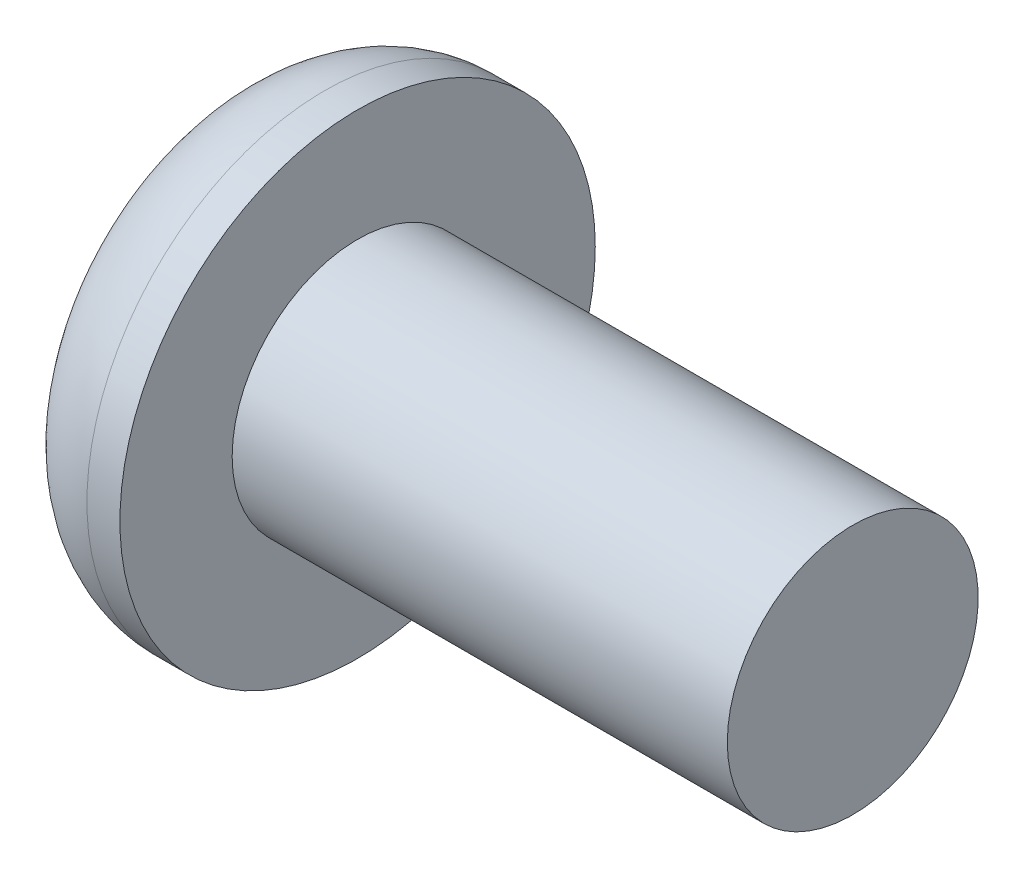
ISO-10303-21;
HEADER;
FILE_DESCRIPTION(('STEP AP214'),'2;1');
FILE_NAME('part.step','',(''),(''),'','','');
FILE_SCHEMA(('AUTOMOTIVE_DESIGN { 1 0 10303 214 1 1 1 1 }'));
ENDSEC;
DATA;
#1=APPLICATION_CONTEXT('core data for automotive mechanical design processes');
#2=APPLICATION_PROTOCOL_DEFINITION('international standard','automotive_design',2000,#1);
#3=PRODUCT_CONTEXT('',#1,'mechanical');
#4=PRODUCT('Part','Part','',(#3));
#5=PRODUCT_RELATED_PRODUCT_CATEGORY('part','',(#4));
#6=PRODUCT_DEFINITION_FORMATION('','',#4);
#7=PRODUCT_DEFINITION_CONTEXT('part definition',#1,'design');
#8=PRODUCT_DEFINITION('design','',#6,#7);
#9=PRODUCT_DEFINITION_SHAPE('','',#8);
#10=(LENGTH_UNIT() NAMED_UNIT(*) SI_UNIT(.MILLI.,.METRE.));
#11=(NAMED_UNIT(*) PLANE_ANGLE_UNIT() SI_UNIT($,.RADIAN.));
#12=(NAMED_UNIT(*) SI_UNIT($,.STERADIAN.) SOLID_ANGLE_UNIT());
#13=UNCERTAINTY_MEASURE_WITH_UNIT(LENGTH_MEASURE(1.E-05),#10,'distance_accuracy_value','');
#14=(GEOMETRIC_REPRESENTATION_CONTEXT(3) GLOBAL_UNCERTAINTY_ASSIGNED_CONTEXT((#13)) GLOBAL_UNIT_ASSIGNED_CONTEXT((#10,
#11,#12)) REPRESENTATION_CONTEXT('',''));
#15=CARTESIAN_POINT('',(0.,0.,0.));
#16=DIRECTION('',(0.,0.,1.));
#17=DIRECTION('',(1.,0.,0.));
#18=AXIS2_PLACEMENT_3D('',#15,#16,#17);
#19=CARTESIAN_POINT('',(2.54,0.,0.));
#20=DIRECTION('',(-1.,0.,0.));
#21=DIRECTION('',(0.,0.,1.));
#22=AXIS2_PLACEMENT_3D('',#19,#20,#21);
#23=CYLINDRICAL_SURFACE('',#22,4.572);
#24=CARTESIAN_POINT('',(1.905,0.,0.));
#25=DIRECTION('',(1.,0.,0.));
#26=DIRECTION('',(0.,0.,-1.));
#27=AXIS2_PLACEMENT_3D('',#24,#25,#26);
#28=CIRCLE('',#27,4.572);
#29=CARTESIAN_POINT('',(1.905,0.,-4.572));
#30=VERTEX_POINT('',#29);
#31=EDGE_CURVE('E41',#30,#30,#28,.T.);
#32=ORIENTED_EDGE('',*,*,#31,.T.);
#33=EDGE_LOOP('',(#32));
#34=FACE_BOUND('',#33,.T.);
#35=CARTESIAN_POINT('',(2.54,0.,0.));
#36=DIRECTION('',(1.,0.,0.));
#37=DIRECTION('',(0.,0.,-1.));
#38=AXIS2_PLACEMENT_3D('',#35,#36,#37);
#39=CIRCLE('',#38,4.572);
#40=CARTESIAN_POINT('',(2.54,0.,-4.572));
#41=VERTEX_POINT('',#40);
#42=EDGE_CURVE('E143',#41,#41,#39,.T.);
#43=ORIENTED_EDGE('',*,*,#42,.F.);
#44=EDGE_LOOP('',(#43));
#45=FACE_BOUND('',#44,.T.);
#46=ADVANCED_FACE('F33',(#34,#45),#23,.T.);
#47=CARTESIAN_POINT('',(2.54,0.,0.));
#48=DIRECTION('',(1.,0.,0.));
#49=DIRECTION('',(0.,0.,-1.));
#50=AXIS2_PLACEMENT_3D('',#47,#48,#49);
#51=PLANE('',#50);
#52=CARTESIAN_POINT('',(2.54,0.,0.));
#53=DIRECTION('',(1.,0.,0.));
#54=DIRECTION('',(0.,0.,-1.));
#55=AXIS2_PLACEMENT_3D('',#52,#53,#54);
#56=CIRCLE('',#55,2.413);
#57=CARTESIAN_POINT('',(2.54,0.,2.413));
#58=VERTEX_POINT('',#57);
#59=EDGE_CURVE('E144',#58,#58,#56,.T.);
#60=ORIENTED_EDGE('',*,*,#59,.F.);
#61=EDGE_LOOP('',(#60));
#62=FACE_BOUND('',#61,.T.);
#63=ORIENTED_EDGE('',*,*,#42,.T.);
#64=EDGE_LOOP('',(#63));
#65=FACE_BOUND('',#64,.T.);
#66=ADVANCED_FACE('F168',(#62,#65),#51,.T.);
#67=CARTESIAN_POINT('',(0.,0.,0.));
#68=DIRECTION('',(1.,0.,0.));
#69=DIRECTION('',(0.,0.,-1.));
#70=AXIS2_PLACEMENT_3D('',#67,#68,#69);
#71=PLANE('',#70);
#72=DIRECTION('',(0.,0.999888133515311,0.0149572876975553));
#73=VECTOR('',#72,1.);
#74=CARTESIAN_POINT('',(0.,-0.940185716053139,1.5736134063559));
#75=LINE('',#74,#73);
#76=CARTESIAN_POINT('',(0.,-0.940185716053139,1.5736134063559));
#77=VERTEX_POINT('',#76);
#78=CARTESIAN_POINT('',(0.,0.892696327613401,1.60103141755523));
#79=VERTEX_POINT('',#78);
#80=EDGE_CURVE('E122',#77,#79,#75,.T.);
#81=ORIENTED_EDGE('',*,*,#80,.F.);
#82=DIRECTION('',(0.,0.48699067563986,0.873407168415644));
#83=VECTOR('',#82,1.);
#84=CARTESIAN_POINT('',(0.,-1.83288204366654,-0.0274180111993328));
#85=LINE('',#84,#83);
#86=CARTESIAN_POINT('',(0.,-1.83288204366654,-0.0274180111993328));
#87=VERTEX_POINT('',#86);
#88=EDGE_CURVE('E48',#87,#77,#85,.T.);
#89=ORIENTED_EDGE('',*,*,#88,.F.);
#90=DIRECTION('',(0.,-0.512897457875451,0.858449880718088));
#91=VECTOR('',#90,1.);
#92=CARTESIAN_POINT('',(0.,-0.892696327613401,-1.60103141755523));
#93=LINE('',#92,#91);
#94=CARTESIAN_POINT('',(0.,-0.892696327613401,-1.60103141755523));
#95=VERTEX_POINT('',#94);
#96=EDGE_CURVE('E131',#95,#87,#93,.T.);
#97=ORIENTED_EDGE('',*,*,#96,.F.);
#98=DIRECTION('',(0.,-0.999888133515311,-0.014957287697555));
#99=VECTOR('',#98,1.);
#100=CARTESIAN_POINT('',(0.,0.940185716053139,-1.5736134063559));
#101=LINE('',#100,#99);
#102=CARTESIAN_POINT('',(0.,0.940185716053139,-1.5736134063559));
#103=VERTEX_POINT('',#102);
#104=EDGE_CURVE('E129',#103,#95,#101,.T.);
#105=ORIENTED_EDGE('',*,*,#104,.F.);
#106=DIRECTION('',(0.,-0.48699067563986,-0.873407168415644));
#107=VECTOR('',#106,1.);
#108=CARTESIAN_POINT('',(0.,1.83288204366654,0.0274180111993334));
#109=LINE('',#108,#107);
#110=CARTESIAN_POINT('',(0.,1.83288204366654,0.0274180111993334));
#111=VERTEX_POINT('',#110);
#112=EDGE_CURVE('E96',#111,#103,#109,.T.);
#113=ORIENTED_EDGE('',*,*,#112,.F.);
#114=DIRECTION('',(0.,0.512897457875451,-0.858449880718088));
#115=VECTOR('',#114,1.);
#116=CARTESIAN_POINT('',(0.,0.892696327613401,1.60103141755523));
#117=LINE('',#116,#115);
#118=EDGE_CURVE('E125',#79,#111,#117,.T.);
#119=ORIENTED_EDGE('',*,*,#118,.F.);
#120=EDGE_LOOP('',(#81,#89,#97,#105,#113,#119));
#121=FACE_BOUND('',#120,.T.);
#122=CARTESIAN_POINT('',(0.,0.,0.));
#123=DIRECTION('',(1.,0.,0.));
#124=DIRECTION('',(0.,0.,-1.));
#125=AXIS2_PLACEMENT_3D('',#122,#123,#124);
#126=CIRCLE('',#125,2.667);
#127=CARTESIAN_POINT('',(0.,0.,-2.667));
#128=VERTEX_POINT('',#127);
#129=EDGE_CURVE('E11',#128,#128,#126,.F.);
#130=ORIENTED_EDGE('',*,*,#129,.T.);
#131=EDGE_LOOP('',(#130));
#132=FACE_BOUND('',#131,.T.);
#133=ADVANCED_FACE('F172',(#121,#132),#71,.F.);
#134=CARTESIAN_POINT('',(12.065,0.,0.));
#135=DIRECTION('',(-1.,0.,0.));
#136=DIRECTION('',(0.,0.,1.));
#137=AXIS2_PLACEMENT_3D('',#134,#135,#136);
#138=CYLINDRICAL_SURFACE('',#137,2.413);
#139=CARTESIAN_POINT('',(12.065,0.,0.));
#140=DIRECTION('',(1.,0.,0.));
#141=DIRECTION('',(0.,0.,-1.));
#142=AXIS2_PLACEMENT_3D('',#139,#140,#141);
#143=CIRCLE('',#142,2.413);
#144=CARTESIAN_POINT('',(12.065,0.,2.413));
#145=VERTEX_POINT('',#144);
#146=EDGE_CURVE('E135',#145,#145,#143,.T.);
#147=CARTESIAN_POINT('',(12.065,0.,2.413));
#148=CARTESIAN_POINT('',(11.96578125,0.,2.413));
#149=CARTESIAN_POINT('',(11.8665625,0.,2.413));
#150=CARTESIAN_POINT('',(11.668125,0.,2.413));
#151=CARTESIAN_POINT('',(11.56890625,0.,2.413));
#152=CARTESIAN_POINT('',(11.37046875,0.,2.413));
#153=CARTESIAN_POINT('',(11.27125,0.,2.413));
#154=CARTESIAN_POINT('',(11.0728125,0.,2.413));
#155=CARTESIAN_POINT('',(10.97359375,0.,2.413));
#156=CARTESIAN_POINT('',(10.77515625,0.,2.413));
#157=CARTESIAN_POINT('',(10.6759375,0.,2.413));
#158=CARTESIAN_POINT('',(10.4775,0.,2.413));
#159=CARTESIAN_POINT('',(10.37828125,0.,2.413));
#160=CARTESIAN_POINT('',(10.17984375,0.,2.413));
#161=CARTESIAN_POINT('',(10.080625,0.,2.413));
#162=CARTESIAN_POINT('',(9.8821875,0.,2.413));
#163=CARTESIAN_POINT('',(9.78296875,0.,2.413));
#164=CARTESIAN_POINT('',(9.58453125,0.,2.413));
#165=CARTESIAN_POINT('',(9.4853125,0.,2.413));
#166=CARTESIAN_POINT('',(9.286875,0.,2.413));
#167=CARTESIAN_POINT('',(9.18765625,0.,2.413));
#168=CARTESIAN_POINT('',(8.98921875,0.,2.413));
#169=CARTESIAN_POINT('',(8.89,0.,2.413));
#170=CARTESIAN_POINT('',(8.6915625,0.,2.413));
#171=CARTESIAN_POINT('',(8.59234375,0.,2.413));
#172=CARTESIAN_POINT('',(8.39390625,0.,2.413));
#173=CARTESIAN_POINT('',(8.2946875,0.,2.413));
#174=CARTESIAN_POINT('',(8.09625,0.,2.413));
#175=CARTESIAN_POINT('',(7.99703125,0.,2.413));
#176=CARTESIAN_POINT('',(7.79859375,0.,2.413));
#177=CARTESIAN_POINT('',(7.699375,0.,2.413));
#178=CARTESIAN_POINT('',(7.5009375,0.,2.413));
#179=CARTESIAN_POINT('',(7.40171875,0.,2.413));
#180=CARTESIAN_POINT('',(7.20328125,0.,2.413));
#181=CARTESIAN_POINT('',(7.1040625,0.,2.413));
#182=CARTESIAN_POINT('',(6.905625,0.,2.413));
#183=CARTESIAN_POINT('',(6.80640625,0.,2.413));
#184=CARTESIAN_POINT('',(6.60796875,0.,2.413));
#185=CARTESIAN_POINT('',(6.50875,0.,2.413));
#186=CARTESIAN_POINT('',(6.3103125,0.,2.413));
#187=CARTESIAN_POINT('',(6.21109375,0.,2.413));
#188=CARTESIAN_POINT('',(6.01265625,0.,2.413));
#189=CARTESIAN_POINT('',(5.9134375,0.,2.413));
#190=CARTESIAN_POINT('',(5.715,0.,2.413));
#191=CARTESIAN_POINT('',(5.61578125,0.,2.413));
#192=CARTESIAN_POINT('',(5.41734375,0.,2.413));
#193=CARTESIAN_POINT('',(5.318125,0.,2.413));
#194=CARTESIAN_POINT('',(5.1196875,0.,2.413));
#195=CARTESIAN_POINT('',(5.02046875,0.,2.413));
#196=CARTESIAN_POINT('',(4.82203125,0.,2.413));
#197=CARTESIAN_POINT('',(4.7228125,0.,2.413));
#198=CARTESIAN_POINT('',(4.524375,0.,2.413));
#199=CARTESIAN_POINT('',(4.42515625,0.,2.413));
#200=CARTESIAN_POINT('',(4.22671875,0.,2.413));
#201=CARTESIAN_POINT('',(4.1275,0.,2.413));
#202=CARTESIAN_POINT('',(3.9290625,0.,2.413));
#203=CARTESIAN_POINT('',(3.82984375,0.,2.413));
#204=CARTESIAN_POINT('',(3.63140625,0.,2.413));
#205=CARTESIAN_POINT('',(3.5321875,0.,2.413));
#206=CARTESIAN_POINT('',(3.33375,0.,2.413));
#207=CARTESIAN_POINT('',(3.23453125,0.,2.413));
#208=CARTESIAN_POINT('',(3.03609375,0.,2.413));
#209=CARTESIAN_POINT('',(2.936875,0.,2.413));
#210=CARTESIAN_POINT('',(2.7384375,0.,2.413));
#211=CARTESIAN_POINT('',(2.63921875,0.,2.413));
#212=CARTESIAN_POINT('',(2.54,0.,2.413));
#213=B_SPLINE_CURVE_WITH_KNOTS('',3,(#147,#148,#149,#150,#151,#152,#153,#154,#155,#156,#157,
#158,#159,#160,#161,#162,#163,#164,#165,#166,#167,#168,#169,#170,#171,#172,#173,#174,#175,#176,
#177,#178,#179,#180,#181,#182,#183,#184,#185,#186,#187,#188,#189,#190,#191,#192,#193,#194,#195,
#196,#197,#198,#199,#200,#201,#202,#203,#204,#205,#206,#207,#208,#209,#210,#211,#212),
.UNSPECIFIED.,.F.,.F.,(4,2,2,2,2,2,2,2,2,2,2,2,2,2,2,2,2,2,2,2,2,2,2,2,2,2,2,2,2,2,2,2,4),(0.,
0.29765625,0.5953125,0.892968750000001,1.190625,1.48828125,1.7859375,2.08359375,2.38125,
2.67890625,2.9765625,3.27421875,3.571875,3.86953125,4.1671875,4.46484375,4.7625,5.06015625,
5.3578125,5.65546875,5.953125,6.25078125,6.5484375,6.84609375,7.14375,7.44140625,7.7390625,
8.03671875,8.334375,8.63203125,8.9296875,9.22734375,9.525),.UNSPECIFIED.);
#214=EDGE_CURVE('BSEAM163',#145,#58,#213,.T.);
#215=ORIENTED_EDGE('',*,*,#146,.F.);
#216=ORIENTED_EDGE('',*,*,#59,.T.);
#217=ORIENTED_EDGE('',*,*,#214,.T.);
#218=ORIENTED_EDGE('',*,*,#214,.F.);
#219=EDGE_LOOP('',(#215,#217,#216,#218));
#220=FACE_BOUND('',#219,.T.);
#221=ADVANCED_FACE('F163',(#220),#138,.T.);
#222=CARTESIAN_POINT('',(12.065,0.,0.));
#223=DIRECTION('',(1.,0.,0.));
#224=DIRECTION('',(0.,0.,-1.));
#225=AXIS2_PLACEMENT_3D('',#222,#223,#224);
#226=PLANE('',#225);
#227=ORIENTED_EDGE('',*,*,#146,.T.);
#228=EDGE_LOOP('',(#227));
#229=FACE_BOUND('',#228,.T.);
#230=ADVANCED_FACE('F155',(#229),#226,.T.);
#231=CARTESIAN_POINT('',(1.905,0.,0.));
#232=DIRECTION('',(1.,0.,0.));
#233=DIRECTION('',(0.,0.,-1.));
#234=AXIS2_PLACEMENT_3D('',#231,#232,#233);
#235=TOROIDAL_SURFACE('',#234,2.667,1.905);
#236=ORIENTED_EDGE('',*,*,#129,.F.);
#237=EDGE_LOOP('',(#236));
#238=FACE_BOUND('',#237,.T.);
#239=ORIENTED_EDGE('',*,*,#31,.F.);
#240=EDGE_LOOP('',(#239));
#241=FACE_BOUND('',#240,.T.);
#242=ADVANCED_FACE('F35',(#238,#241),#235,.T.);
#243=CARTESIAN_POINT('',(1.905,-1.83288204366654,-0.0274180111993328));
#244=DIRECTION('',(0.,-0.873407168415644,0.48699067563986));
#245=DIRECTION('',(0.,-0.48699067563986,-0.873407168415644));
#246=AXIS2_PLACEMENT_3D('',#243,#244,#245);
#247=PLANE('',#246);
#248=ORIENTED_EDGE('',*,*,#88,.T.);
#249=DIRECTION('',(-1.,0.,0.));
#250=VECTOR('',#249,1.);
#251=CARTESIAN_POINT('',(1.905,-0.940185716053139,1.5736134063559));
#252=LINE('',#251,#250);
#253=CARTESIAN_POINT('',(1.905,-0.940185716053139,1.5736134063559));
#254=VERTEX_POINT('',#253);
#255=EDGE_CURVE('E78',#254,#77,#252,.T.);
#256=ORIENTED_EDGE('',*,*,#255,.F.);
#257=DIRECTION('',(0.,0.48699067563986,0.873407168415644));
#258=VECTOR('',#257,1.);
#259=CARTESIAN_POINT('',(1.905,-1.83288204366654,-0.0274180111993328));
#260=LINE('',#259,#258);
#261=CARTESIAN_POINT('',(1.905,-1.83288204366654,-0.0274180111993328));
#262=VERTEX_POINT('',#261);
#263=EDGE_CURVE('E133',#262,#254,#260,.T.);
#264=ORIENTED_EDGE('',*,*,#263,.F.);
#265=DIRECTION('',(-1.,0.,0.));
#266=VECTOR('',#265,1.);
#267=CARTESIAN_POINT('',(1.905,-1.83288204366654,-0.0274180111993328));
#268=LINE('',#267,#266);
#269=EDGE_CURVE('E56',#262,#87,#268,.T.);
#270=ORIENTED_EDGE('',*,*,#269,.T.);
#271=EDGE_LOOP('',(#248,#256,#264,#270));
#272=FACE_BOUND('',#271,.T.);
#273=ADVANCED_FACE('F154',(#272),#247,.F.);
#274=CARTESIAN_POINT('',(1.905,-0.892696327613401,-1.60103141755523));
#275=DIRECTION('',(0.,-0.858449880718088,-0.512897457875451));
#276=DIRECTION('',(0.,0.512897457875451,-0.858449880718088));
#277=AXIS2_PLACEMENT_3D('',#274,#275,#276);
#278=PLANE('',#277);
#279=ORIENTED_EDGE('',*,*,#96,.T.);
#280=ORIENTED_EDGE('',*,*,#269,.F.);
#281=DIRECTION('',(0.,-0.512897457875451,0.858449880718088));
#282=VECTOR('',#281,1.);
#283=CARTESIAN_POINT('',(1.905,-0.892696327613401,-1.60103141755523));
#284=LINE('',#283,#282);
#285=CARTESIAN_POINT('',(1.905,-0.892696327613401,-1.60103141755523));
#286=VERTEX_POINT('',#285);
#287=EDGE_CURVE('E108',#286,#262,#284,.T.);
#288=ORIENTED_EDGE('',*,*,#287,.F.);
#289=DIRECTION('',(-1.,0.,0.));
#290=VECTOR('',#289,1.);
#291=CARTESIAN_POINT('',(1.905,-0.892696327613401,-1.60103141755523));
#292=LINE('',#291,#290);
#293=EDGE_CURVE('E100',#286,#95,#292,.T.);
#294=ORIENTED_EDGE('',*,*,#293,.T.);
#295=EDGE_LOOP('',(#279,#280,#288,#294));
#296=FACE_BOUND('',#295,.T.);
#297=ADVANCED_FACE('F161',(#296),#278,.F.);
#298=CARTESIAN_POINT('',(1.905,0.940185716053139,-1.5736134063559));
#299=DIRECTION('',(0.,0.014957287697555,-0.999888133515311));
#300=DIRECTION('',(0.,0.999888133515311,0.014957287697555));
#301=AXIS2_PLACEMENT_3D('',#298,#299,#300);
#302=PLANE('',#301);
#303=ORIENTED_EDGE('',*,*,#104,.T.);
#304=ORIENTED_EDGE('',*,*,#293,.F.);
#305=DIRECTION('',(0.,-0.999888133515311,-0.014957287697555));
#306=VECTOR('',#305,1.);
#307=CARTESIAN_POINT('',(1.905,0.940185716053139,-1.5736134063559));
#308=LINE('',#307,#306);
#309=CARTESIAN_POINT('',(1.905,0.940185716053139,-1.5736134063559));
#310=VERTEX_POINT('',#309);
#311=EDGE_CURVE('E104',#310,#286,#308,.T.);
#312=ORIENTED_EDGE('',*,*,#311,.F.);
#313=DIRECTION('',(-1.,0.,0.));
#314=VECTOR('',#313,1.);
#315=CARTESIAN_POINT('',(1.905,0.940185716053139,-1.5736134063559));
#316=LINE('',#315,#314);
#317=EDGE_CURVE('E89',#310,#103,#316,.T.);
#318=ORIENTED_EDGE('',*,*,#317,.T.);
#319=EDGE_LOOP('',(#303,#304,#312,#318));
#320=FACE_BOUND('',#319,.T.);
#321=ADVANCED_FACE('F105',(#320),#302,.F.);
#322=CARTESIAN_POINT('',(1.905,1.83288204366654,0.0274180111993334));
#323=DIRECTION('',(0.,0.873407168415644,-0.48699067563986));
#324=DIRECTION('',(0.,0.48699067563986,0.873407168415644));
#325=AXIS2_PLACEMENT_3D('',#322,#323,#324);
#326=PLANE('',#325);
#327=ORIENTED_EDGE('',*,*,#112,.T.);
#328=ORIENTED_EDGE('',*,*,#317,.F.);
#329=DIRECTION('',(0.,-0.48699067563986,-0.873407168415644));
#330=VECTOR('',#329,1.);
#331=CARTESIAN_POINT('',(1.905,1.83288204366654,0.0274180111993334));
#332=LINE('',#331,#330);
#333=CARTESIAN_POINT('',(1.905,1.83288204366654,0.0274180111993334));
#334=VERTEX_POINT('',#333);
#335=EDGE_CURVE('E93',#334,#310,#332,.T.);
#336=ORIENTED_EDGE('',*,*,#335,.F.);
#337=DIRECTION('',(-1.,0.,0.));
#338=VECTOR('',#337,1.);
#339=CARTESIAN_POINT('',(1.905,1.83288204366654,0.0274180111993334));
#340=LINE('',#339,#338);
#341=EDGE_CURVE('E101',#334,#111,#340,.T.);
#342=ORIENTED_EDGE('',*,*,#341,.T.);
#343=EDGE_LOOP('',(#327,#328,#336,#342));
#344=FACE_BOUND('',#343,.T.);
#345=ADVANCED_FACE('F91',(#344),#326,.F.);
#346=CARTESIAN_POINT('',(1.905,0.892696327613401,1.60103141755523));
#347=DIRECTION('',(0.,0.858449880718088,0.512897457875451));
#348=DIRECTION('',(0.,-0.512897457875451,0.858449880718088));
#349=AXIS2_PLACEMENT_3D('',#346,#347,#348);
#350=PLANE('',#349);
#351=ORIENTED_EDGE('',*,*,#118,.T.);
#352=ORIENTED_EDGE('',*,*,#341,.F.);
#353=DIRECTION('',(0.,0.512897457875451,-0.858449880718088));
#354=VECTOR('',#353,1.);
#355=CARTESIAN_POINT('',(1.905,0.892696327613401,1.60103141755523));
#356=LINE('',#355,#354);
#357=CARTESIAN_POINT('',(1.905,0.892696327613401,1.60103141755523));
#358=VERTEX_POINT('',#357);
#359=EDGE_CURVE('E114',#358,#334,#356,.T.);
#360=ORIENTED_EDGE('',*,*,#359,.F.);
#361=DIRECTION('',(-1.,0.,0.));
#362=VECTOR('',#361,1.);
#363=CARTESIAN_POINT('',(1.905,0.892696327613401,1.60103141755523));
#364=LINE('',#363,#362);
#365=EDGE_CURVE('E138',#358,#79,#364,.T.);
#366=ORIENTED_EDGE('',*,*,#365,.T.);
#367=EDGE_LOOP('',(#351,#352,#360,#366));
#368=FACE_BOUND('',#367,.T.);
#369=ADVANCED_FACE('F185',(#368),#350,.F.);
#370=CARTESIAN_POINT('',(1.905,-0.940185716053139,1.5736134063559));
#371=DIRECTION('',(0.,-0.0149572876975553,0.999888133515311));
#372=DIRECTION('',(0.,-0.999888133515311,-0.0149572876975553));
#373=AXIS2_PLACEMENT_3D('',#370,#371,#372);
#374=PLANE('',#373);
#375=ORIENTED_EDGE('',*,*,#80,.T.);
#376=ORIENTED_EDGE('',*,*,#365,.F.);
#377=DIRECTION('',(0.,0.999888133515311,0.0149572876975553));
#378=VECTOR('',#377,1.);
#379=CARTESIAN_POINT('',(1.905,-0.940185716053139,1.5736134063559));
#380=LINE('',#379,#378);
#381=EDGE_CURVE('E116',#254,#358,#380,.T.);
#382=ORIENTED_EDGE('',*,*,#381,.F.);
#383=ORIENTED_EDGE('',*,*,#255,.T.);
#384=EDGE_LOOP('',(#375,#376,#382,#383));
#385=FACE_BOUND('',#384,.T.);
#386=ADVANCED_FACE('F182',(#385),#374,.F.);
#387=CARTESIAN_POINT('',(1.905,0.,0.));
#388=DIRECTION('',(-1.,0.,0.));
#389=DIRECTION('',(0.,0.,1.));
#390=AXIS2_PLACEMENT_3D('',#387,#388,#389);
#391=PLANE('',#390);
#392=ORIENTED_EDGE('',*,*,#263,.T.);
#393=ORIENTED_EDGE('',*,*,#381,.T.);
#394=ORIENTED_EDGE('',*,*,#359,.T.);
#395=ORIENTED_EDGE('',*,*,#335,.T.);
#396=ORIENTED_EDGE('',*,*,#311,.T.);
#397=ORIENTED_EDGE('',*,*,#287,.T.);
#398=EDGE_LOOP('',(#392,#393,#394,#395,#396,#397));
#399=FACE_BOUND('',#398,.T.);
#400=ADVANCED_FACE('F111',(#399),#391,.T.);
#401=CLOSED_SHELL('',(#46,#66,#133,#221,#230,#242,#273,#297,#321,#345,#369,#386,#400));
#402=MANIFOLD_SOLID_BREP('B2',#401);
#403=ADVANCED_BREP_SHAPE_REPRESENTATION('',(#18,#402),#14);
#404=SHAPE_DEFINITION_REPRESENTATION(#9,#403);
ENDSEC;
END-ISO-10303-21;
